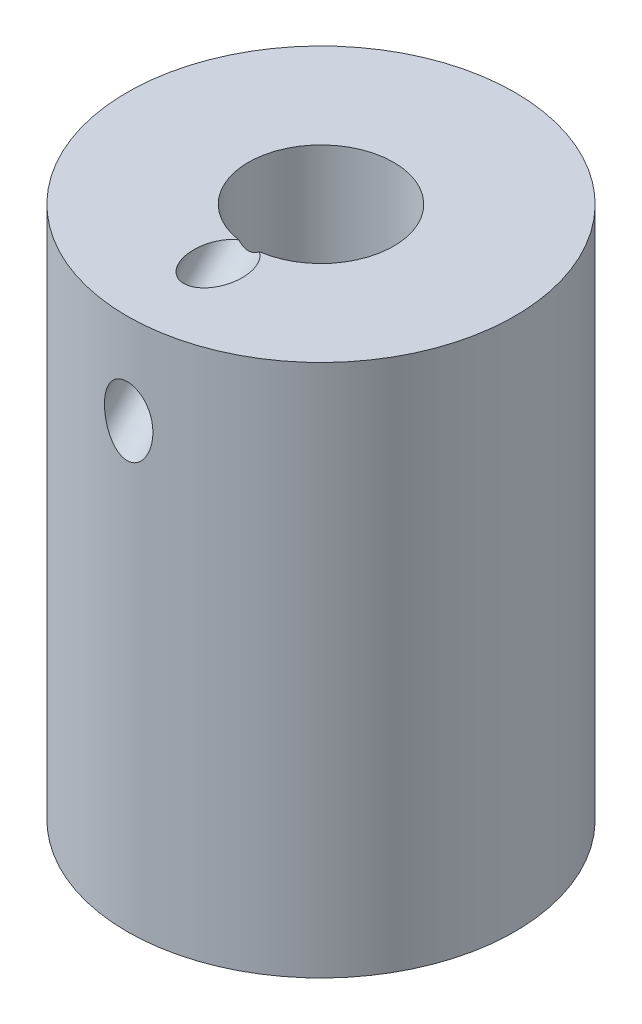
ISO-10303-21;
HEADER;
FILE_DESCRIPTION(('STEP AP214'),'2;1');
FILE_NAME('part.step','',(''),(''),'','','');
FILE_SCHEMA(('AUTOMOTIVE_DESIGN { 1 0 10303 214 1 1 1 1 }'));
ENDSEC;
DATA;
#1=APPLICATION_CONTEXT('core data for automotive mechanical design processes');
#2=APPLICATION_PROTOCOL_DEFINITION('international standard','automotive_design',2000,#1);
#3=PRODUCT_CONTEXT('',#1,'mechanical');
#4=PRODUCT('Part','Part','',(#3));
#5=PRODUCT_RELATED_PRODUCT_CATEGORY('part','',(#4));
#6=PRODUCT_DEFINITION_FORMATION('','',#4);
#7=PRODUCT_DEFINITION_CONTEXT('part definition',#1,'design');
#8=PRODUCT_DEFINITION('design','',#6,#7);
#9=PRODUCT_DEFINITION_SHAPE('','',#8);
#10=(LENGTH_UNIT() NAMED_UNIT(*) SI_UNIT(.MILLI.,.METRE.));
#11=(NAMED_UNIT(*) PLANE_ANGLE_UNIT() SI_UNIT($,.RADIAN.));
#12=(NAMED_UNIT(*) SI_UNIT($,.STERADIAN.) SOLID_ANGLE_UNIT());
#13=UNCERTAINTY_MEASURE_WITH_UNIT(LENGTH_MEASURE(1.E-05),#10,'distance_accuracy_value','');
#14=(GEOMETRIC_REPRESENTATION_CONTEXT(3) GLOBAL_UNCERTAINTY_ASSIGNED_CONTEXT((#13)) GLOBAL_UNIT_ASSIGNED_CONTEXT((#10,
#11,#12)) REPRESENTATION_CONTEXT('',''));
#15=CARTESIAN_POINT('',(0.,0.,0.));
#16=DIRECTION('',(0.,0.,1.));
#17=DIRECTION('',(1.,0.,0.));
#18=AXIS2_PLACEMENT_3D('',#15,#16,#17);
#19=CARTESIAN_POINT('',(0.,34.925,0.));
#20=DIRECTION('',(0.,-1.,0.));
#21=DIRECTION('',(0.,0.,-1.));
#22=AXIS2_PLACEMENT_3D('',#19,#20,#21);
#23=CYLINDRICAL_SURFACE('',#22,12.7);
#24=CARTESIAN_POINT('',(0.,26.7268109697327,12.7));
#25=CARTESIAN_POINT('',(0.0677231360557602,26.726819614256,12.69999908584));
#26=CARTESIAN_POINT('',(0.135576640045858,26.7335630787863,12.6994495681687));
#27=CARTESIAN_POINT('',(0.268820607228429,26.759848667837,12.6973309971783));
#28=CARTESIAN_POINT('',(0.334203044361097,26.7794292443308,12.6957588809035));
#29=CARTESIAN_POINT('',(0.459915132146433,26.8293242361348,12.6918242364828));
#30=CARTESIAN_POINT('',(0.520286915151365,26.8595348205826,12.6894693659464));
#31=CARTESIAN_POINT('',(0.63572705500686,26.9286082814338,12.6842105349097));
#32=CARTESIAN_POINT('',(0.690795096083354,26.9674716725522,12.6813065417463));
#33=CARTESIAN_POINT('',(0.822083274082134,27.0735149521319,12.6736126095751));
#34=CARTESIAN_POINT('',(0.894781434633359,27.1450322979659,12.6686157474421));
#35=CARTESIAN_POINT('',(1.02807808797234,27.298585406056,12.6584964304899));
#36=CARTESIAN_POINT('',(1.08864295473588,27.3806493928152,12.6533736696337));
#37=CARTESIAN_POINT('',(1.22403158099804,27.5917350676796,12.6411360978687));
#38=CARTESIAN_POINT('',(1.29243425042368,27.724878582651,12.6341997436164));
#39=CARTESIAN_POINT('',(1.40750629939765,28.0001738734266,12.6218949849178));
#40=CARTESIAN_POINT('',(1.45415265785603,28.1423350112701,12.6165282435606));
#41=CARTESIAN_POINT('',(1.52816370255405,28.4366990399286,12.6077812716521));
#42=CARTESIAN_POINT('',(1.55483011486164,28.5890787888782,12.6044736108906));
#43=CARTESIAN_POINT('',(1.58635687806056,28.8960945949221,12.6005446266623));
#44=CARTESIAN_POINT('',(1.591220268419,29.0507303345026,12.5999229287573));
#45=CARTESIAN_POINT('',(1.57826378456329,29.3561197122806,12.6015526374034));
#46=CARTESIAN_POINT('',(1.56087671669442,29.5068909656772,12.6037492259876));
#47=CARTESIAN_POINT('',(1.50223602292819,29.8037286595018,12.6108762981731));
#48=CARTESIAN_POINT('',(1.4610088155679,29.9498001191804,12.6158037553015));
#49=CARTESIAN_POINT('',(1.3666056251318,30.1944629539871,12.6263204720667));
#50=CARTESIAN_POINT('',(1.31946403747111,30.2954027141947,12.6313909580411));
#51=CARTESIAN_POINT('',(1.20990085695124,30.4886146214141,12.6423565520849));
#52=CARTESIAN_POINT('',(1.14750062280868,30.5808986368527,12.6482505025857));
#53=CARTESIAN_POINT('',(1.02168784590854,30.7345590322887,12.6589589497999));
#54=CARTESIAN_POINT('',(0.961238480323841,30.7983566533448,12.6637402731007));
#55=CARTESIAN_POINT('',(0.830726609714553,30.9152955654987,12.6729694808405));
#56=CARTESIAN_POINT('',(0.760674648370664,30.9684483892247,12.6774177228329));
#57=CARTESIAN_POINT('',(0.623367234854563,31.0541266168079,12.6848487141458));
#58=CARTESIAN_POINT('',(0.557313345889693,31.0885613014216,12.6879514951213));
#59=CARTESIAN_POINT('',(0.420338748315795,31.1459707672199,12.693226499526));
#60=CARTESIAN_POINT('',(0.349420226803791,31.1689506604592,12.695399137999));
#61=CARTESIAN_POINT('',(0.2042965611388,31.2021527106326,12.6985646673113));
#62=CARTESIAN_POINT('',(0.130079239631437,31.2123226796684,12.699552731388));
#63=CARTESIAN_POINT('',(-0.0189757976205721,31.2190483953212,12.7002042758607));
#64=CARTESIAN_POINT('',(-0.0938134034758814,31.215606504054,12.6998679860768));
#65=CARTESIAN_POINT('',(-0.236377808102215,31.1960759324061,12.6979862373347));
#66=CARTESIAN_POINT('',(-0.304233507555627,31.1808976686424,12.6965278599629));
#67=CARTESIAN_POINT('',(-0.436575132746412,31.1398523097539,12.6926667424658));
#68=CARTESIAN_POINT('',(-0.501060904950933,31.1139847281044,12.6902639593561));
#69=CARTESIAN_POINT('',(-0.627937417197943,31.051533141542,12.6846324972248));
#70=CARTESIAN_POINT('',(-0.690126195936957,31.0145444304876,12.6813733510589));
#71=CARTESIAN_POINT('',(-0.808442540508353,30.931965013852,12.6743812571237));
#72=CARTESIAN_POINT('',(-0.864566734581891,30.886369561436,12.6706480482705));
#73=CARTESIAN_POINT('',(-0.99248481014265,30.7675232419423,12.6613843283891));
#74=CARTESIAN_POINT('',(-1.06096229694249,30.6906992443495,12.6557573760326));
#75=CARTESIAN_POINT('',(-1.1845148582806,30.5269163971285,12.6447926650158));
#76=CARTESIAN_POINT('',(-1.23956335621167,30.4399379460816,12.6394554958118));
#77=CARTESIAN_POINT('',(-1.3526029071473,30.2295036400928,12.6279335603814));
#78=CARTESIAN_POINT('',(-1.40569427773459,30.1034051708779,12.6220403793156));
#79=CARTESIAN_POINT('',(-1.49102177000263,29.8443552135873,12.612242572483));
#80=CARTESIAN_POINT('',(-1.52323228601555,29.7113955265515,12.6083403894703));
#81=CARTESIAN_POINT('',(-1.57470933363711,29.405963642501,12.602030814806));
#82=CARTESIAN_POINT('',(-1.58814789089278,29.2324998389543,12.6003096993373));
#83=CARTESIAN_POINT('',(-1.58680286332724,28.8854515268253,12.6004777416774));
#84=CARTESIAN_POINT('',(-1.57197078029921,28.7118673223988,12.6023731035492));
#85=CARTESIAN_POINT('',(-1.52902616490226,28.4543028487876,12.6076267624031));
#86=CARTESIAN_POINT('',(-1.51111700913224,28.3684873497375,12.6097970539593));
#87=CARTESIAN_POINT('',(-1.46819627407423,28.1986206030203,12.6148673118465));
#88=CARTESIAN_POINT('',(-1.44318291625234,28.1145698028108,12.6177674608762));
#89=CARTESIAN_POINT('',(-1.38592447297335,27.9492012952162,12.6241847494481));
#90=CARTESIAN_POINT('',(-1.35369638621324,27.8678776718936,12.6277004345442));
#91=CARTESIAN_POINT('',(-1.28165218885927,27.7087344772825,12.6352158241176));
#92=CARTESIAN_POINT('',(-1.24184165482471,27.6309123824497,12.6392151720976));
#93=CARTESIAN_POINT('',(-1.14833848075805,27.4699611937916,12.6480756146298));
#94=CARTESIAN_POINT('',(-1.09350736422959,27.3874861822779,12.6529807924644));
#95=CARTESIAN_POINT('',(-0.972661298943151,27.2311665098497,12.6628432524902));
#96=CARTESIAN_POINT('',(-0.906662713071951,27.1573094853632,12.6678004486355));
#97=CARTESIAN_POINT('',(-0.77918416074423,27.0374685519027,12.676196749542));
#98=CARTESIAN_POINT('',(-0.720094191469487,26.988966553863,12.6797245922185));
#99=CARTESIAN_POINT('',(-0.59487891683907,26.9019215178883,12.6862141006452));
#100=CARTESIAN_POINT('',(-0.528761123297704,26.8633679945189,12.68917636164));
#101=CARTESIAN_POINT('',(-0.403932658912451,26.8054454361215,12.6936970550403));
#102=CARTESIAN_POINT('',(-0.346286443593622,26.7838026209171,12.6954165222596));
#103=CARTESIAN_POINT('',(-0.228238467241611,26.7504416900191,12.698085033841));
#104=CARTESIAN_POINT('',(-0.167844839630611,26.7386960633157,12.6990362134887));
#105=CARTESIAN_POINT('',(-0.0892016095755346,26.7305158294271,12.6996993158294));
#106=CARTESIAN_POINT('',(-0.0713934598085861,26.7291288714202,12.6998118247553));
#107=CARTESIAN_POINT('',(-0.0357265707923764,26.7272752163974,12.6999622943049));
#108=CARTESIAN_POINT('',(-0.0178678228262282,26.7268086889935,12.7000002411886));
#109=CARTESIAN_POINT('',(0.,26.7268109697327,12.7));
#110=B_SPLINE_CURVE_WITH_KNOTS('',3,(#24,#25,#26,#27,#28,#29,#30,#31,#32,#33,#34,#35,#36,#37,
#38,#39,#40,#41,#42,#43,#44,#45,#46,#47,#48,#49,#50,#51,#52,#53,#54,#55,#56,#57,#58,#59,#60,#61,
#62,#63,#64,#65,#66,#67,#68,#69,#70,#71,#72,#73,#74,#75,#76,#77,#78,#79,#80,#81,#82,#83,#84,#85,
#86,#87,#88,#89,#90,#91,#92,#93,#94,#95,#96,#97,#98,#99,#100,#101,#102,#103,#104,#105,#106,#107,
#108,#109),.UNSPECIFIED.,.T.,.F.,(4,2,2,2,2,2,2,2,2,2,2,2,2,2,2,2,2,2,2,2,2,2,2,2,2,2,2,2,2,2,2,
2,2,2,2,2,2,2,2,2,2,2,4),(0.,0.203079852536745,0.406770801978348,0.608524995544033,
0.810291193730407,1.11487944191742,1.42030048632574,1.86742118632702,2.31501393251536,
2.77760081670706,3.24012321161125,3.69378408092957,4.14694318509299,4.48038031132907,
4.81335334490736,5.07641743105684,5.33919495177263,5.56191468367913,5.78453493083046,
6.00805923455952,6.23154475100037,6.43924542255587,6.64695554865527,6.86339550023559,
7.07995517454122,7.38745171443489,7.69555195557206,8.10417345530575,8.51329509418188,
9.03267653651395,9.55294977829418,9.81577478796487,10.0786656538492,10.3409435197715,
10.6030292314442,10.899686751819,11.1959133067889,11.4247234325859,11.6532914042351,
11.8373544120152,12.0209040798572,12.0744740496431,12.128053890094),.UNSPECIFIED.);
#111=CARTESIAN_POINT('',(0.,26.7268109697327,12.7));
#112=VERTEX_POINT('',#111);
#113=EDGE_CURVE('E65',#112,#112,#110,.T.);
#114=ORIENTED_EDGE('',*,*,#113,.F.);
#115=EDGE_LOOP('',(#114));
#116=FACE_BOUND('',#115,.T.);
#117=CARTESIAN_POINT('',(0.,34.925,0.));
#118=DIRECTION('',(0.,-1.,0.));
#119=DIRECTION('',(0.,0.,-1.));
#120=AXIS2_PLACEMENT_3D('',#117,#118,#119);
#121=CIRCLE('',#120,12.7);
#122=CARTESIAN_POINT('',(0.,34.925,-12.7));
#123=VERTEX_POINT('',#122);
#124=EDGE_CURVE('E50',#123,#123,#121,.T.);
#125=ORIENTED_EDGE('',*,*,#124,.T.);
#126=EDGE_LOOP('',(#125));
#127=FACE_BOUND('',#126,.T.);
#128=CARTESIAN_POINT('',(0.,0.,0.));
#129=DIRECTION('',(0.,-1.,0.));
#130=DIRECTION('',(0.,0.,-1.));
#131=AXIS2_PLACEMENT_3D('',#128,#129,#130);
#132=CIRCLE('',#131,12.7);
#133=CARTESIAN_POINT('',(0.,0.,-12.7));
#134=VERTEX_POINT('',#133);
#135=EDGE_CURVE('E79',#134,#134,#132,.T.);
#136=ORIENTED_EDGE('',*,*,#135,.F.);
#137=EDGE_LOOP('',(#136));
#138=FACE_BOUND('',#137,.T.);
#139=ADVANCED_FACE('F37',(#116,#127,#138),#23,.T.);
#140=CARTESIAN_POINT('',(0.,34.925,0.));
#141=DIRECTION('',(0.,-1.,0.));
#142=DIRECTION('',(0.,0.,-1.));
#143=AXIS2_PLACEMENT_3D('',#140,#141,#142);
#144=PLANE('',#143);
#145=CARTESIAN_POINT('',(0.,34.925,0.));
#146=DIRECTION('',(0.,1.,0.));
#147=DIRECTION('',(0.,0.,1.));
#148=AXIS2_PLACEMENT_3D('',#145,#146,#147);
#149=CIRCLE('',#148,4.7625);
#150=CARTESIAN_POINT('',(0.674451355071265,34.925,4.71450120581621));
#151=VERTEX_POINT('',#150);
#152=CARTESIAN_POINT('',(-0.674451355071262,34.925,4.71450120581621));
#153=VERTEX_POINT('',#152);
#154=EDGE_CURVE('E64',#151,#153,#149,.T.);
#155=ORIENTED_EDGE('',*,*,#154,.F.);
#156=CARTESIAN_POINT('',(0.,34.925,6.746875));
#157=DIRECTION('',(0.,-1.,0.));
#158=DIRECTION('',(0.,0.,1.));
#159=AXIS2_PLACEMENT_3D('',#156,#157,#158);
#160=ELLIPSE('',#159,2.24506403026728,1.58749999999999);
#161=EDGE_CURVE('E56',#151,#153,#160,.T.);
#162=ORIENTED_EDGE('',*,*,#161,.T.);
#163=EDGE_LOOP('',(#155,#162));
#164=FACE_BOUND('',#163,.T.);
#165=ORIENTED_EDGE('',*,*,#124,.F.);
#166=EDGE_LOOP('',(#165));
#167=FACE_BOUND('',#166,.T.);
#168=ADVANCED_FACE('F62',(#164,#167),#144,.F.);
#169=CARTESIAN_POINT('',(0.,0.,0.));
#170=DIRECTION('',(0.,-1.,0.));
#171=DIRECTION('',(0.,0.,-1.));
#172=AXIS2_PLACEMENT_3D('',#169,#170,#171);
#173=PLANE('',#172);
#174=CARTESIAN_POINT('',(0.,0.,0.));
#175=DIRECTION('',(0.,-1.,0.));
#176=DIRECTION('',(0.,0.,-1.));
#177=AXIS2_PLACEMENT_3D('',#174,#175,#176);
#178=CIRCLE('',#177,8.79607808188369);
#179=CARTESIAN_POINT('',(0.,0.,-8.79607808188369));
#180=VERTEX_POINT('',#179);
#181=EDGE_CURVE('E71',#180,#180,#178,.T.);
#182=ORIENTED_EDGE('',*,*,#181,.F.);
#183=EDGE_LOOP('',(#182));
#184=FACE_BOUND('',#183,.T.);
#185=ORIENTED_EDGE('',*,*,#135,.T.);
#186=EDGE_LOOP('',(#185));
#187=FACE_BOUND('',#186,.T.);
#188=ADVANCED_FACE('F85',(#184,#187),#173,.T.);
#189=CARTESIAN_POINT('',(0.,38.1,0.));
#190=DIRECTION('',(0.,-1.,0.));
#191=DIRECTION('',(0.,0.,-1.));
#192=AXIS2_PLACEMENT_3D('',#189,#190,#191);
#193=CONICAL_SURFACE('',#192,0.,0.226892802759256);
#194=CARTESIAN_POINT('',(0.,17.4713461487211,0.));
#195=DIRECTION('',(0.,-1.,0.));
#196=DIRECTION('',(0.,0.,-1.));
#197=AXIS2_PLACEMENT_3D('',#194,#195,#196);
#198=CIRCLE('',#197,4.7625);
#199=CARTESIAN_POINT('',(0.,17.4713461487211,-4.7625));
#200=VERTEX_POINT('',#199);
#201=EDGE_CURVE('E68',#200,#200,#198,.T.);
#202=ORIENTED_EDGE('',*,*,#201,.F.);
#203=EDGE_LOOP('',(#202));
#204=FACE_BOUND('',#203,.T.);
#205=ORIENTED_EDGE('',*,*,#181,.T.);
#206=EDGE_LOOP('',(#205));
#207=FACE_BOUND('',#206,.T.);
#208=ADVANCED_FACE('F101',(#204,#207),#193,.F.);
#209=CARTESIAN_POINT('',(0.,34.925,0.));
#210=DIRECTION('',(0.,1.,0.));
#211=DIRECTION('',(0.,0.,1.));
#212=AXIS2_PLACEMENT_3D('',#209,#210,#211);
#213=CYLINDRICAL_SURFACE('',#212,4.7625);
#214=ORIENTED_EDGE('',*,*,#201,.T.);
#215=EDGE_LOOP('',(#214));
#216=FACE_BOUND('',#215,.T.);
#217=ORIENTED_EDGE('',*,*,#154,.T.);
#218=CARTESIAN_POINT('',(-0.674451355071262,34.925,4.71450120581621));
#219=CARTESIAN_POINT('',(-0.629037393027884,34.8883438669956,4.72099980722197));
#220=CARTESIAN_POINT('',(-0.581266820834068,34.8542116910567,4.72716212116062));
#221=CARTESIAN_POINT('',(-0.480878622747078,34.7925207117822,4.73843201200988));
#222=CARTESIAN_POINT('',(-0.428215520596955,34.7650344055507,4.74352788130271));
#223=CARTESIAN_POINT('',(-0.318480366526638,34.7188402460519,4.75215904697981));
#224=CARTESIAN_POINT('',(-0.261379268836053,34.7001971014265,4.7556828290187));
#225=CARTESIAN_POINT('',(-0.144837153925788,34.6739923012002,4.76065120457598));
#226=CARTESIAN_POINT('',(-0.0854095731562751,34.6663745491008,4.76210632264889));
#227=CARTESIAN_POINT('',(0.0279418152630389,34.6631472415541,4.76272203669783));
#228=CARTESIAN_POINT('',(0.0818346900184083,34.6664347970202,4.76209337693946));
#229=CARTESIAN_POINT('',(0.188265935982325,34.6822947538143,4.75907622997345));
#230=CARTESIAN_POINT('',(0.240801237497568,34.694886565894,4.75668406372271));
#231=CARTESIAN_POINT('',(0.352661335176822,34.7313504263862,4.74981478619229));
#232=CARTESIAN_POINT('',(0.41141466422434,34.7568935939295,4.74503107269193));
#233=CARTESIAN_POINT('',(0.523833728666724,34.8169774718545,4.73394225991526));
#234=CARTESIAN_POINT('',(0.577500034611189,34.8515171715719,4.72763733153703));
#235=CARTESIAN_POINT('',(0.644077690016427,34.9009784234442,4.71877259532882));
#236=CARTESIAN_POINT('',(0.65938903739748,34.9128489276402,4.71665574185541));
#237=CARTESIAN_POINT('',(0.674451355071263,34.925,4.71450120581621));
#238=B_SPLINE_CURVE_WITH_KNOTS('',3,(#218,#219,#220,#221,#222,#223,#224,#225,#226,#227,#228,
#229,#230,#231,#232,#233,#234,#235,#236,#237),.UNSPECIFIED.,.F.,.F.,(4,2,2,2,2,2,2,2,2,4),(0.,
0.176389079489966,0.354623313903009,0.534142367422283,0.712744788986089,0.87385696750031,
1.03530621427482,1.2269965746801,1.41866541000368,1.47711008049428),.UNSPECIFIED.);
#239=EDGE_CURVE('E11',#153,#151,#238,.T.);
#240=ORIENTED_EDGE('',*,*,#239,.T.);
#241=EDGE_LOOP('',(#217,#240));
#242=FACE_BOUND('',#241,.T.);
#243=ADVANCED_FACE('F67',(#216,#242),#213,.F.);
#244=CARTESIAN_POINT('',(0.,20.8359375,20.8359375));
#245=DIRECTION('',(0.,-0.707106781186547,0.707106781186548));
#246=DIRECTION('',(0.,-0.707106781186548,-0.707106781186547));
#247=AXIS2_PLACEMENT_3D('',#244,#245,#246);
#248=CYLINDRICAL_SURFACE('',#247,1.58749999999999);
#249=ORIENTED_EDGE('',*,*,#113,.T.);
#250=EDGE_LOOP('',(#249));
#251=FACE_BOUND('',#250,.T.);
#252=ORIENTED_EDGE('',*,*,#239,.F.);
#253=ORIENTED_EDGE('',*,*,#161,.F.);
#254=EDGE_LOOP('',(#252,#253));
#255=FACE_BOUND('',#254,.T.);
#256=ADVANCED_FACE('F57',(#251,#255),#248,.F.);
#257=CLOSED_SHELL('',(#139,#168,#188,#208,#243,#256));
#258=MANIFOLD_SOLID_BREP('B2',#257);
#259=ADVANCED_BREP_SHAPE_REPRESENTATION('',(#18,#258),#14);
#260=SHAPE_DEFINITION_REPRESENTATION(#9,#259);
ENDSEC;
END-ISO-10303-21;
